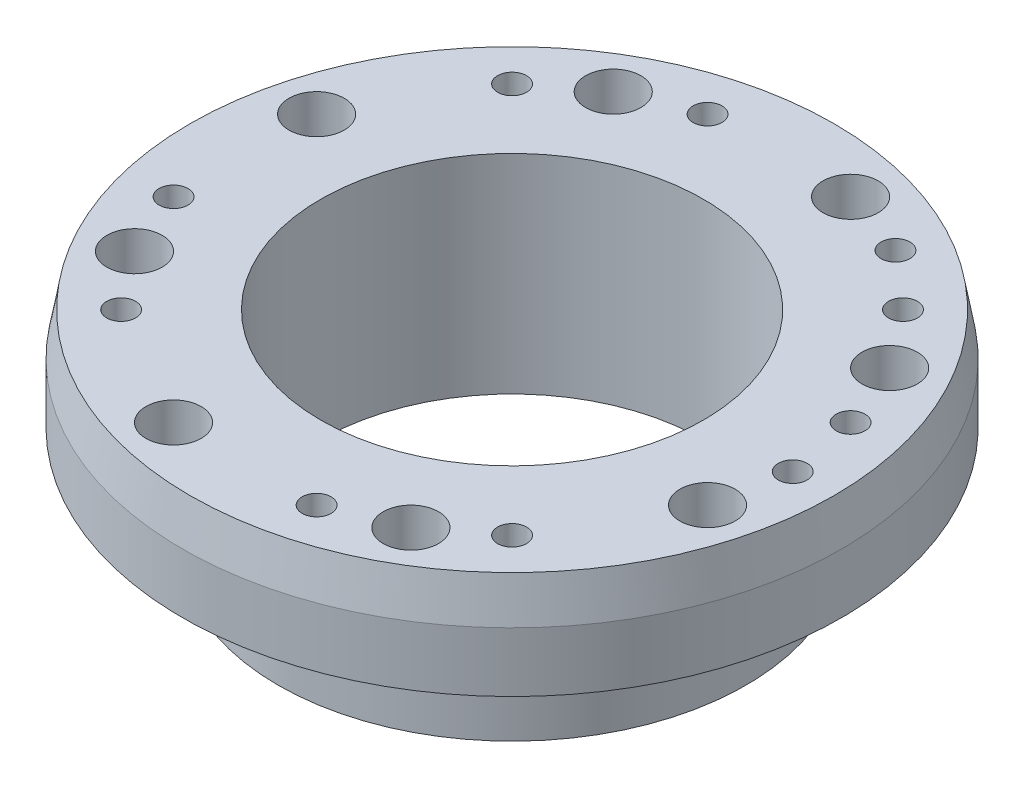
ISO-10303-21;
HEADER;
FILE_DESCRIPTION(('STEP AP214'),'2;1');
FILE_NAME('part.step','',(''),(''),'','','');
FILE_SCHEMA(('AUTOMOTIVE_DESIGN { 1 0 10303 214 1 1 1 1 }'));
ENDSEC;
DATA;
#1=APPLICATION_CONTEXT('core data for automotive mechanical design processes');
#2=APPLICATION_PROTOCOL_DEFINITION('international standard','automotive_design',2000,#1);
#3=PRODUCT_CONTEXT('',#1,'mechanical');
#4=PRODUCT('Part','Part','',(#3));
#5=PRODUCT_RELATED_PRODUCT_CATEGORY('part','',(#4));
#6=PRODUCT_DEFINITION_FORMATION('','',#4);
#7=PRODUCT_DEFINITION_CONTEXT('part definition',#1,'design');
#8=PRODUCT_DEFINITION('design','',#6,#7);
#9=PRODUCT_DEFINITION_SHAPE('','',#8);
#10=(LENGTH_UNIT() NAMED_UNIT(*) SI_UNIT(.MILLI.,.METRE.));
#11=(NAMED_UNIT(*) PLANE_ANGLE_UNIT() SI_UNIT($,.RADIAN.));
#12=(NAMED_UNIT(*) SI_UNIT($,.STERADIAN.) SOLID_ANGLE_UNIT());
#13=UNCERTAINTY_MEASURE_WITH_UNIT(LENGTH_MEASURE(1.E-05),#10,'distance_accuracy_value','');
#14=(GEOMETRIC_REPRESENTATION_CONTEXT(3) GLOBAL_UNCERTAINTY_ASSIGNED_CONTEXT((#13)) GLOBAL_UNIT_ASSIGNED_CONTEXT((#10,
#11,#12)) REPRESENTATION_CONTEXT('',''));
#15=CARTESIAN_POINT('',(0.,0.,0.));
#16=DIRECTION('',(0.,0.,1.));
#17=DIRECTION('',(1.,0.,0.));
#18=AXIS2_PLACEMENT_3D('',#15,#16,#17);
#19=CARTESIAN_POINT('',(0.,-25.,0.));
#20=DIRECTION('',(0.,1.,0.));
#21=DIRECTION('',(0.,0.,1.));
#22=AXIS2_PLACEMENT_3D('',#19,#20,#21);
#23=CYLINDRICAL_SURFACE('',#22,55.);
#24=CARTESIAN_POINT('',(0.,-25.,0.));
#25=DIRECTION('',(0.,1.,0.));
#26=DIRECTION('',(0.,0.,1.));
#27=AXIS2_PLACEMENT_3D('',#24,#25,#26);
#28=CIRCLE('',#27,55.);
#29=CARTESIAN_POINT('',(0.,-25.,55.));
#30=VERTEX_POINT('',#29);
#31=EDGE_CURVE('E19',#30,#30,#28,.F.);
#32=ORIENTED_EDGE('',*,*,#31,.F.);
#33=EDGE_LOOP('',(#32));
#34=FACE_BOUND('',#33,.T.);
#35=CARTESIAN_POINT('',(0.,0.,0.));
#36=DIRECTION('',(0.,1.,0.));
#37=DIRECTION('',(0.,0.,1.));
#38=AXIS2_PLACEMENT_3D('',#35,#36,#37);
#39=CIRCLE('',#38,55.);
#40=CARTESIAN_POINT('',(0.,0.,55.));
#41=VERTEX_POINT('',#40);
#42=EDGE_CURVE('E185',#41,#41,#39,.F.);
#43=ORIENTED_EDGE('',*,*,#42,.T.);
#44=EDGE_LOOP('',(#43));
#45=FACE_BOUND('',#44,.T.);
#46=ADVANCED_FACE('F16',(#34,#45),#23,.T.);
#47=CARTESIAN_POINT('',(-32.5,24.,-56.2916512459887));
#48=DIRECTION('',(0.,1.,0.));
#49=DIRECTION('',(0.,0.,1.));
#50=AXIS2_PLACEMENT_3D('',#47,#48,#49);
#51=CYLINDRICAL_SURFACE('',#50,3.5);
#52=CARTESIAN_POINT('',(-32.5,0.,-56.2916512459887));
#53=DIRECTION('',(0.,1.,0.));
#54=DIRECTION('',(0.,0.,1.));
#55=AXIS2_PLACEMENT_3D('',#52,#53,#54);
#56=CIRCLE('',#55,3.5);
#57=CARTESIAN_POINT('',(-32.5,0.,-52.7916512459887));
#58=VERTEX_POINT('',#57);
#59=EDGE_CURVE('E188',#58,#58,#56,.F.);
#60=ORIENTED_EDGE('',*,*,#59,.T.);
#61=EDGE_LOOP('',(#60));
#62=FACE_BOUND('',#61,.T.);
#63=CARTESIAN_POINT('',(-32.5,14.,-56.2916512459887));
#64=DIRECTION('',(0.,1.,0.));
#65=DIRECTION('',(0.,0.,1.));
#66=AXIS2_PLACEMENT_3D('',#63,#64,#65);
#67=CIRCLE('',#66,3.5);
#68=CARTESIAN_POINT('',(-32.5,14.,-52.7916512459887));
#69=VERTEX_POINT('',#68);
#70=EDGE_CURVE('E182',#69,#69,#67,.T.);
#71=ORIENTED_EDGE('',*,*,#70,.T.);
#72=EDGE_LOOP('',(#71));
#73=FACE_BOUND('',#72,.T.);
#74=ADVANCED_FACE('F219',(#62,#73),#51,.F.);
#75=CARTESIAN_POINT('',(-62.7851787087894,24.,-16.8232379316641));
#76=DIRECTION('',(0.,1.,0.));
#77=DIRECTION('',(0.,0.,1.));
#78=AXIS2_PLACEMENT_3D('',#75,#76,#77);
#79=CYLINDRICAL_SURFACE('',#78,3.5);
#80=CARTESIAN_POINT('',(-62.7851787087894,0.,-16.8232379316641));
#81=DIRECTION('',(0.,1.,0.));
#82=DIRECTION('',(0.,0.,1.));
#83=AXIS2_PLACEMENT_3D('',#80,#81,#82);
#84=CIRCLE('',#83,3.5);
#85=CARTESIAN_POINT('',(-62.7851787087894,0.,-13.3232379316641));
#86=VERTEX_POINT('',#85);
#87=EDGE_CURVE('E191',#86,#86,#84,.F.);
#88=ORIENTED_EDGE('',*,*,#87,.T.);
#89=EDGE_LOOP('',(#88));
#90=FACE_BOUND('',#89,.T.);
#91=CARTESIAN_POINT('',(-62.7851787087894,14.,-16.8232379316641));
#92=DIRECTION('',(0.,1.,0.));
#93=DIRECTION('',(0.,0.,1.));
#94=AXIS2_PLACEMENT_3D('',#91,#92,#93);
#95=CIRCLE('',#94,3.5);
#96=CARTESIAN_POINT('',(-62.7851787087894,14.,-13.3232379316641));
#97=VERTEX_POINT('',#96);
#98=EDGE_CURVE('E179',#97,#97,#95,.T.);
#99=ORIENTED_EDGE('',*,*,#98,.T.);
#100=EDGE_LOOP('',(#99));
#101=FACE_BOUND('',#100,.T.);
#102=ADVANCED_FACE('F407',(#90,#101),#79,.F.);
#103=CARTESIAN_POINT('',(-56.2916512459886,24.,32.5));
#104=DIRECTION('',(0.,1.,0.));
#105=DIRECTION('',(0.,0.,1.));
#106=AXIS2_PLACEMENT_3D('',#103,#104,#105);
#107=CYLINDRICAL_SURFACE('',#106,3.5);
#108=CARTESIAN_POINT('',(-56.2916512459886,0.,32.5));
#109=DIRECTION('',(0.,1.,0.));
#110=DIRECTION('',(0.,0.,1.));
#111=AXIS2_PLACEMENT_3D('',#108,#109,#110);
#112=CIRCLE('',#111,3.5);
#113=CARTESIAN_POINT('',(-56.2916512459886,0.,36.));
#114=VERTEX_POINT('',#113);
#115=EDGE_CURVE('E194',#114,#114,#112,.F.);
#116=ORIENTED_EDGE('',*,*,#115,.T.);
#117=EDGE_LOOP('',(#116));
#118=FACE_BOUND('',#117,.T.);
#119=CARTESIAN_POINT('',(-56.2916512459886,14.,32.5));
#120=DIRECTION('',(0.,1.,0.));
#121=DIRECTION('',(0.,0.,1.));
#122=AXIS2_PLACEMENT_3D('',#119,#120,#121);
#123=CIRCLE('',#122,3.5);
#124=CARTESIAN_POINT('',(-56.2916512459886,14.,36.));
#125=VERTEX_POINT('',#124);
#126=EDGE_CURVE('E176',#125,#125,#123,.T.);
#127=ORIENTED_EDGE('',*,*,#126,.T.);
#128=EDGE_LOOP('',(#127));
#129=FACE_BOUND('',#128,.T.);
#130=ADVANCED_FACE('F403',(#118,#129),#107,.F.);
#131=CARTESIAN_POINT('',(-16.8232379316634,24.,62.7851787087896));
#132=DIRECTION('',(0.,1.,0.));
#133=DIRECTION('',(0.,0.,1.));
#134=AXIS2_PLACEMENT_3D('',#131,#132,#133);
#135=CYLINDRICAL_SURFACE('',#134,3.5);
#136=CARTESIAN_POINT('',(-16.8232379316634,0.,62.7851787087896));
#137=DIRECTION('',(0.,1.,0.));
#138=DIRECTION('',(0.,0.,1.));
#139=AXIS2_PLACEMENT_3D('',#136,#137,#138);
#140=CIRCLE('',#139,3.5);
#141=CARTESIAN_POINT('',(-16.8232379316634,0.,66.2851787087896));
#142=VERTEX_POINT('',#141);
#143=EDGE_CURVE('E197',#142,#142,#140,.F.);
#144=ORIENTED_EDGE('',*,*,#143,.T.);
#145=EDGE_LOOP('',(#144));
#146=FACE_BOUND('',#145,.T.);
#147=CARTESIAN_POINT('',(-16.8232379316634,14.,62.7851787087896));
#148=DIRECTION('',(0.,1.,0.));
#149=DIRECTION('',(0.,0.,1.));
#150=AXIS2_PLACEMENT_3D('',#147,#148,#149);
#151=CIRCLE('',#150,3.5);
#152=CARTESIAN_POINT('',(-16.8232379316634,14.,66.2851787087896));
#153=VERTEX_POINT('',#152);
#154=EDGE_CURVE('E173',#153,#153,#151,.T.);
#155=ORIENTED_EDGE('',*,*,#154,.T.);
#156=EDGE_LOOP('',(#155));
#157=FACE_BOUND('',#156,.T.);
#158=ADVANCED_FACE('F399',(#146,#157),#135,.F.);
#159=CARTESIAN_POINT('',(32.5,24.,56.2916512459885));
#160=DIRECTION('',(0.,1.,0.));
#161=DIRECTION('',(0.,0.,1.));
#162=AXIS2_PLACEMENT_3D('',#159,#160,#161);
#163=CYLINDRICAL_SURFACE('',#162,3.5);
#164=CARTESIAN_POINT('',(32.5,0.,56.2916512459885));
#165=DIRECTION('',(0.,1.,0.));
#166=DIRECTION('',(0.,0.,1.));
#167=AXIS2_PLACEMENT_3D('',#164,#165,#166);
#168=CIRCLE('',#167,3.5);
#169=CARTESIAN_POINT('',(32.5,0.,59.7916512459885));
#170=VERTEX_POINT('',#169);
#171=EDGE_CURVE('E200',#170,#170,#168,.F.);
#172=ORIENTED_EDGE('',*,*,#171,.T.);
#173=EDGE_LOOP('',(#172));
#174=FACE_BOUND('',#173,.T.);
#175=CARTESIAN_POINT('',(32.5,14.,56.2916512459885));
#176=DIRECTION('',(0.,1.,0.));
#177=DIRECTION('',(0.,0.,1.));
#178=AXIS2_PLACEMENT_3D('',#175,#176,#177);
#179=CIRCLE('',#178,3.5);
#180=CARTESIAN_POINT('',(32.5,14.,59.7916512459885));
#181=VERTEX_POINT('',#180);
#182=EDGE_CURVE('E170',#181,#181,#179,.T.);
#183=ORIENTED_EDGE('',*,*,#182,.T.);
#184=EDGE_LOOP('',(#183));
#185=FACE_BOUND('',#184,.T.);
#186=ADVANCED_FACE('F395',(#174,#185),#163,.F.);
#187=CARTESIAN_POINT('',(62.7851787087895,24.,16.8232379316636));
#188=DIRECTION('',(0.,1.,0.));
#189=DIRECTION('',(0.,0.,1.));
#190=AXIS2_PLACEMENT_3D('',#187,#188,#189);
#191=CYLINDRICAL_SURFACE('',#190,3.5);
#192=CARTESIAN_POINT('',(62.7851787087895,0.,16.8232379316636));
#193=DIRECTION('',(0.,1.,0.));
#194=DIRECTION('',(0.,0.,1.));
#195=AXIS2_PLACEMENT_3D('',#192,#193,#194);
#196=CIRCLE('',#195,3.5);
#197=CARTESIAN_POINT('',(62.7851787087895,0.,20.3232379316636));
#198=VERTEX_POINT('',#197);
#199=EDGE_CURVE('E203',#198,#198,#196,.F.);
#200=ORIENTED_EDGE('',*,*,#199,.T.);
#201=EDGE_LOOP('',(#200));
#202=FACE_BOUND('',#201,.T.);
#203=CARTESIAN_POINT('',(62.7851787087895,14.,16.8232379316636));
#204=DIRECTION('',(0.,1.,0.));
#205=DIRECTION('',(0.,0.,1.));
#206=AXIS2_PLACEMENT_3D('',#203,#204,#205);
#207=CIRCLE('',#206,3.5);
#208=CARTESIAN_POINT('',(62.7851787087895,14.,20.3232379316636));
#209=VERTEX_POINT('',#208);
#210=EDGE_CURVE('E167',#209,#209,#207,.T.);
#211=ORIENTED_EDGE('',*,*,#210,.T.);
#212=EDGE_LOOP('',(#211));
#213=FACE_BOUND('',#212,.T.);
#214=ADVANCED_FACE('F391',(#202,#213),#191,.F.);
#215=CARTESIAN_POINT('',(56.2916512459884,24.,-32.5));
#216=DIRECTION('',(0.,1.,0.));
#217=DIRECTION('',(0.,0.,1.));
#218=AXIS2_PLACEMENT_3D('',#215,#216,#217);
#219=CYLINDRICAL_SURFACE('',#218,3.5);
#220=CARTESIAN_POINT('',(56.2916512459884,0.,-32.5));
#221=DIRECTION('',(0.,1.,0.));
#222=DIRECTION('',(0.,0.,1.));
#223=AXIS2_PLACEMENT_3D('',#220,#221,#222);
#224=CIRCLE('',#223,3.5);
#225=CARTESIAN_POINT('',(56.2916512459884,0.,-29.));
#226=VERTEX_POINT('',#225);
#227=EDGE_CURVE('E206',#226,#226,#224,.F.);
#228=ORIENTED_EDGE('',*,*,#227,.T.);
#229=EDGE_LOOP('',(#228));
#230=FACE_BOUND('',#229,.T.);
#231=CARTESIAN_POINT('',(56.2916512459884,14.,-32.5));
#232=DIRECTION('',(0.,1.,0.));
#233=DIRECTION('',(0.,0.,1.));
#234=AXIS2_PLACEMENT_3D('',#231,#232,#233);
#235=CIRCLE('',#234,3.5);
#236=CARTESIAN_POINT('',(56.2916512459884,14.,-29.));
#237=VERTEX_POINT('',#236);
#238=EDGE_CURVE('E164',#237,#237,#235,.T.);
#239=ORIENTED_EDGE('',*,*,#238,.T.);
#240=EDGE_LOOP('',(#239));
#241=FACE_BOUND('',#240,.T.);
#242=ADVANCED_FACE('F385',(#230,#241),#219,.F.);
#243=CARTESIAN_POINT('',(16.8232379316634,24.,-62.7851787087896));
#244=DIRECTION('',(0.,1.,0.));
#245=DIRECTION('',(0.,0.,1.));
#246=AXIS2_PLACEMENT_3D('',#243,#244,#245);
#247=CYLINDRICAL_SURFACE('',#246,3.5);
#248=CARTESIAN_POINT('',(16.8232379316634,0.,-62.7851787087896));
#249=DIRECTION('',(0.,1.,0.));
#250=DIRECTION('',(0.,0.,1.));
#251=AXIS2_PLACEMENT_3D('',#248,#249,#250);
#252=CIRCLE('',#251,3.5);
#253=CARTESIAN_POINT('',(16.8232379316634,0.,-59.2851787087896));
#254=VERTEX_POINT('',#253);
#255=EDGE_CURVE('E208',#254,#254,#252,.F.);
#256=ORIENTED_EDGE('',*,*,#255,.T.);
#257=EDGE_LOOP('',(#256));
#258=FACE_BOUND('',#257,.T.);
#259=CARTESIAN_POINT('',(16.8232379316634,14.,-62.7851787087896));
#260=DIRECTION('',(0.,1.,0.));
#261=DIRECTION('',(0.,0.,1.));
#262=AXIS2_PLACEMENT_3D('',#259,#260,#261);
#263=CIRCLE('',#262,3.5);
#264=CARTESIAN_POINT('',(16.8232379316634,14.,-59.2851787087896));
#265=VERTEX_POINT('',#264);
#266=EDGE_CURVE('E161',#265,#265,#263,.T.);
#267=ORIENTED_EDGE('',*,*,#266,.T.);
#268=EDGE_LOOP('',(#267));
#269=FACE_BOUND('',#268,.T.);
#270=ADVANCED_FACE('F379',(#258,#269),#247,.F.);
#271=CARTESIAN_POINT('',(0.,-25.,0.));
#272=DIRECTION('',(0.,-1.,0.));
#273=DIRECTION('',(0.,0.,-1.));
#274=AXIS2_PLACEMENT_3D('',#271,#272,#273);
#275=PLANE('',#274);
#276=ORIENTED_EDGE('',*,*,#31,.T.);
#277=EDGE_LOOP('',(#276));
#278=FACE_BOUND('',#277,.T.);
#279=CARTESIAN_POINT('',(0.,-25.,0.));
#280=DIRECTION('',(0.,1.,0.));
#281=DIRECTION('',(0.,0.,1.));
#282=AXIS2_PLACEMENT_3D('',#279,#280,#281);
#283=CIRCLE('',#282,45.);
#284=CARTESIAN_POINT('',(0.,-25.,45.));
#285=VERTEX_POINT('',#284);
#286=EDGE_CURVE('E55',#285,#285,#283,.T.);
#287=ORIENTED_EDGE('',*,*,#286,.T.);
#288=EDGE_LOOP('',(#287));
#289=FACE_BOUND('',#288,.T.);
#290=ADVANCED_FACE('F42',(#278,#289),#275,.T.);
#291=CARTESIAN_POINT('',(-45.9619407771263,4.25000000001319,45.9619407771249));
#292=DIRECTION('',(0.,1.,0.));
#293=DIRECTION('',(0.,0.,1.));
#294=AXIS2_PLACEMENT_3D('',#291,#292,#293);
#295=CONICAL_SURFACE('',#294,3.39999999996446,1.02974425866465);
#296=CARTESIAN_POINT('',(-45.9619407771263,2.20707389530616,45.9619407771249));
#297=VERTEX_POINT('',#296);
#298=VERTEX_LOOP('',#297);
#299=FACE_BOUND('',#298,.T.);
#300=CARTESIAN_POINT('',(-45.9619407771263,4.25,45.9619407771249));
#301=DIRECTION('',(0.,1.,0.));
#302=DIRECTION('',(0.,0.,1.));
#303=AXIS2_PLACEMENT_3D('',#300,#301,#302);
#304=CIRCLE('',#303,3.4);
#305=CARTESIAN_POINT('',(-45.9619407771263,4.25,49.3619407771249));
#306=VERTEX_POINT('',#305);
#307=EDGE_CURVE('E46',#306,#306,#304,.T.);
#308=ORIENTED_EDGE('',*,*,#307,.T.);
#309=EDGE_LOOP('',(#308));
#310=FACE_BOUND('',#309,.T.);
#311=ADVANCED_FACE('F38',(#299,#310),#295,.F.);
#312=CARTESIAN_POINT('',(45.9619407771254,4.25000000001319,45.9619407771258));
#313=DIRECTION('',(0.,1.,0.));
#314=DIRECTION('',(0.,0.,1.));
#315=AXIS2_PLACEMENT_3D('',#312,#313,#314);
#316=CONICAL_SURFACE('',#315,3.3999999999635,1.0297442586644);
#317=CARTESIAN_POINT('',(45.9619407771254,2.20707389530616,45.9619407771258));
#318=VERTEX_POINT('',#317);
#319=VERTEX_LOOP('',#318);
#320=FACE_BOUND('',#319,.T.);
#321=CARTESIAN_POINT('',(45.9619407771254,4.25,45.9619407771258));
#322=DIRECTION('',(0.,1.,0.));
#323=DIRECTION('',(0.,0.,1.));
#324=AXIS2_PLACEMENT_3D('',#321,#322,#323);
#325=CIRCLE('',#324,3.4);
#326=CARTESIAN_POINT('',(45.9619407771254,4.25,49.3619407771258));
#327=VERTEX_POINT('',#326);
#328=EDGE_CURVE('E48',#327,#327,#325,.T.);
#329=ORIENTED_EDGE('',*,*,#328,.T.);
#330=EDGE_LOOP('',(#329));
#331=FACE_BOUND('',#330,.T.);
#332=ADVANCED_FACE('F41',(#320,#331),#316,.F.);
#333=CARTESIAN_POINT('',(45.961940777126,4.25000000001319,-45.9619407771252));
#334=DIRECTION('',(0.,1.,0.));
#335=DIRECTION('',(0.,0.,1.));
#336=AXIS2_PLACEMENT_3D('',#333,#334,#335);
#337=CONICAL_SURFACE('',#336,3.39999999997738,1.02974425866801);
#338=CARTESIAN_POINT('',(45.961940777126,2.20707389530616,-45.9619407771252));
#339=VERTEX_POINT('',#338);
#340=VERTEX_LOOP('',#339);
#341=FACE_BOUND('',#340,.T.);
#342=CARTESIAN_POINT('',(45.961940777126,4.25,-45.9619407771252));
#343=DIRECTION('',(0.,1.,0.));
#344=DIRECTION('',(0.,0.,1.));
#345=AXIS2_PLACEMENT_3D('',#342,#343,#344);
#346=CIRCLE('',#345,3.4);
#347=CARTESIAN_POINT('',(45.961940777126,4.25,-42.5619407771252));
#348=VERTEX_POINT('',#347);
#349=EDGE_CURVE('E52',#348,#348,#346,.T.);
#350=ORIENTED_EDGE('',*,*,#349,.T.);
#351=EDGE_LOOP('',(#350));
#352=FACE_BOUND('',#351,.T.);
#353=ADVANCED_FACE('F272',(#341,#352),#337,.F.);
#354=CARTESIAN_POINT('',(-45.9619407771254,4.25000000001319,-45.9619407771258));
#355=DIRECTION('',(0.,1.,0.));
#356=DIRECTION('',(0.,0.,1.));
#357=AXIS2_PLACEMENT_3D('',#354,#355,#356);
#358=CONICAL_SURFACE('',#357,3.39999999997802,1.02974425866817);
#359=CARTESIAN_POINT('',(-45.9619407771254,2.20707389530616,-45.9619407771258));
#360=VERTEX_POINT('',#359);
#361=VERTEX_LOOP('',#360);
#362=FACE_BOUND('',#361,.T.);
#363=CARTESIAN_POINT('',(-45.9619407771254,4.25,-45.9619407771258));
#364=DIRECTION('',(0.,1.,0.));
#365=DIRECTION('',(0.,0.,1.));
#366=AXIS2_PLACEMENT_3D('',#363,#364,#365);
#367=CIRCLE('',#366,3.4);
#368=CARTESIAN_POINT('',(-45.9619407771254,4.25,-42.5619407771258));
#369=VERTEX_POINT('',#368);
#370=EDGE_CURVE('E154',#369,#369,#367,.T.);
#371=ORIENTED_EDGE('',*,*,#370,.T.);
#372=EDGE_LOOP('',(#371));
#373=FACE_BOUND('',#372,.T.);
#374=ADVANCED_FACE('F226',(#362,#373),#358,.F.);
#375=CARTESIAN_POINT('',(0.,0.,0.));
#376=DIRECTION('',(0.,1.,0.));
#377=DIRECTION('',(0.,0.,1.));
#378=AXIS2_PLACEMENT_3D('',#375,#376,#377);
#379=PLANE('',#378);
#380=ORIENTED_EDGE('',*,*,#42,.F.);
#381=EDGE_LOOP('',(#380));
#382=FACE_BOUND('',#381,.T.);
#383=CARTESIAN_POINT('',(66.,0.,-2.4980018054066E-13));
#384=DIRECTION('',(0.,1.,0.));
#385=DIRECTION('',(0.,0.,1.));
#386=AXIS2_PLACEMENT_3D('',#383,#384,#385);
#387=CIRCLE('',#386,3.4);
#388=CARTESIAN_POINT('',(66.,0.,3.39999999999975));
#389=VERTEX_POINT('',#388);
#390=EDGE_CURVE('E49',#389,#389,#387,.T.);
#391=ORIENTED_EDGE('',*,*,#390,.T.);
#392=EDGE_LOOP('',(#391));
#393=FACE_BOUND('',#392,.T.);
#394=CARTESIAN_POINT('',(-62.7851787087896,0.,16.8232379316632));
#395=DIRECTION('',(0.,1.,0.));
#396=DIRECTION('',(0.,0.,1.));
#397=AXIS2_PLACEMENT_3D('',#394,#395,#396);
#398=CIRCLE('',#397,3.4);
#399=CARTESIAN_POINT('',(-62.7851787087896,0.,20.2232379316632));
#400=VERTEX_POINT('',#399);
#401=EDGE_CURVE('E152',#400,#400,#398,.T.);
#402=ORIENTED_EDGE('',*,*,#401,.T.);
#403=EDGE_LOOP('',(#402));
#404=FACE_BOUND('',#403,.T.);
#405=CARTESIAN_POINT('',(16.8232379316639,0.,62.7851787087894));
#406=DIRECTION('',(0.,1.,0.));
#407=DIRECTION('',(0.,0.,1.));
#408=AXIS2_PLACEMENT_3D('',#405,#406,#407);
#409=CIRCLE('',#408,3.4);
#410=CARTESIAN_POINT('',(16.8232379316639,0.,66.1851787087894));
#411=VERTEX_POINT('',#410);
#412=EDGE_CURVE('E149',#411,#411,#409,.T.);
#413=ORIENTED_EDGE('',*,*,#412,.T.);
#414=EDGE_LOOP('',(#413));
#415=FACE_BOUND('',#414,.T.);
#416=CARTESIAN_POINT('',(62.7851787087895,0.,-16.8232379316637));
#417=DIRECTION('',(0.,1.,0.));
#418=DIRECTION('',(0.,0.,1.));
#419=AXIS2_PLACEMENT_3D('',#416,#417,#418);
#420=CIRCLE('',#419,3.4);
#421=CARTESIAN_POINT('',(62.7851787087895,0.,-13.4232379316637));
#422=VERTEX_POINT('',#421);
#423=EDGE_CURVE('E146',#422,#422,#420,.T.);
#424=ORIENTED_EDGE('',*,*,#423,.T.);
#425=EDGE_LOOP('',(#424));
#426=FACE_BOUND('',#425,.T.);
#427=CARTESIAN_POINT('',(-16.8232379316639,0.,-62.7851787087894));
#428=DIRECTION('',(0.,1.,0.));
#429=DIRECTION('',(0.,0.,1.));
#430=AXIS2_PLACEMENT_3D('',#427,#428,#429);
#431=CIRCLE('',#430,3.4);
#432=CARTESIAN_POINT('',(-16.8232379316639,0.,-59.3851787087894));
#433=VERTEX_POINT('',#432);
#434=EDGE_CURVE('E143',#433,#433,#431,.T.);
#435=ORIENTED_EDGE('',*,*,#434,.T.);
#436=EDGE_LOOP('',(#435));
#437=FACE_BOUND('',#436,.T.);
#438=CARTESIAN_POINT('',(32.9999999999996,0.,-57.1576766497732));
#439=DIRECTION('',(0.,1.,0.));
#440=DIRECTION('',(0.,0.,1.));
#441=AXIS2_PLACEMENT_3D('',#438,#439,#440);
#442=CIRCLE('',#441,3.4);
#443=CARTESIAN_POINT('',(32.9999999999996,0.,-53.7576766497732));
#444=VERTEX_POINT('',#443);
#445=EDGE_CURVE('E140',#444,#444,#442,.T.);
#446=ORIENTED_EDGE('',*,*,#445,.T.);
#447=EDGE_LOOP('',(#446));
#448=FACE_BOUND('',#447,.T.);
#449=ORIENTED_EDGE('',*,*,#59,.F.);
#450=EDGE_LOOP('',(#449));
#451=FACE_BOUND('',#450,.T.);
#452=ORIENTED_EDGE('',*,*,#87,.F.);
#453=EDGE_LOOP('',(#452));
#454=FACE_BOUND('',#453,.T.);
#455=ORIENTED_EDGE('',*,*,#115,.F.);
#456=EDGE_LOOP('',(#455));
#457=FACE_BOUND('',#456,.T.);
#458=ORIENTED_EDGE('',*,*,#143,.F.);
#459=EDGE_LOOP('',(#458));
#460=FACE_BOUND('',#459,.T.);
#461=ORIENTED_EDGE('',*,*,#171,.F.);
#462=EDGE_LOOP('',(#461));
#463=FACE_BOUND('',#462,.T.);
#464=ORIENTED_EDGE('',*,*,#199,.F.);
#465=EDGE_LOOP('',(#464));
#466=FACE_BOUND('',#465,.T.);
#467=ORIENTED_EDGE('',*,*,#227,.F.);
#468=EDGE_LOOP('',(#467));
#469=FACE_BOUND('',#468,.T.);
#470=ORIENTED_EDGE('',*,*,#255,.F.);
#471=EDGE_LOOP('',(#470));
#472=FACE_BOUND('',#471,.T.);
#473=CARTESIAN_POINT('',(0.,0.,0.));
#474=DIRECTION('',(0.,-1.,0.));
#475=DIRECTION('',(0.,0.,-1.));
#476=AXIS2_PLACEMENT_3D('',#473,#474,#475);
#477=CIRCLE('',#476,77.5);
#478=CARTESIAN_POINT('',(0.,0.,-77.5));
#479=VERTEX_POINT('',#478);
#480=EDGE_CURVE('E158',#479,#479,#477,.F.);
#481=ORIENTED_EDGE('',*,*,#480,.F.);
#482=EDGE_LOOP('',(#481));
#483=FACE_BOUND('',#482,.T.);
#484=ADVANCED_FACE('F222',(#382,#393,#404,#415,#426,#437,#448,#451,#454,#457,#460,#463,#466,
#469,#472,#483),#379,.F.);
#485=CARTESIAN_POINT('',(-29.,14.,-56.2916512459887));
#486=DIRECTION('',(0.,-1.,0.));
#487=DIRECTION('',(0.,0.,-1.));
#488=AXIS2_PLACEMENT_3D('',#485,#486,#487);
#489=PLANE('',#488);
#490=CARTESIAN_POINT('',(-32.5,14.,-56.2916512459887));
#491=DIRECTION('',(0.,1.,0.));
#492=DIRECTION('',(0.,0.,1.));
#493=AXIS2_PLACEMENT_3D('',#490,#491,#492);
#494=CIRCLE('',#493,6.5);
#495=CARTESIAN_POINT('',(-32.5,14.,-49.7916512459887));
#496=VERTEX_POINT('',#495);
#497=EDGE_CURVE('E137',#496,#496,#494,.T.);
#498=ORIENTED_EDGE('',*,*,#497,.T.);
#499=EDGE_LOOP('',(#498));
#500=FACE_BOUND('',#499,.T.);
#501=ORIENTED_EDGE('',*,*,#70,.F.);
#502=EDGE_LOOP('',(#501));
#503=FACE_BOUND('',#502,.T.);
#504=ADVANCED_FACE('F225',(#500,#503),#489,.F.);
#505=CARTESIAN_POINT('',(-59.2851787087894,14.,-16.8232379316641));
#506=DIRECTION('',(0.,-1.,0.));
#507=DIRECTION('',(0.,0.,-1.));
#508=AXIS2_PLACEMENT_3D('',#505,#506,#507);
#509=PLANE('',#508);
#510=CARTESIAN_POINT('',(-62.7851787087894,14.,-16.8232379316641));
#511=DIRECTION('',(0.,1.,0.));
#512=DIRECTION('',(0.,0.,1.));
#513=AXIS2_PLACEMENT_3D('',#510,#511,#512);
#514=CIRCLE('',#513,6.5);
#515=CARTESIAN_POINT('',(-62.7851787087894,14.,-10.3232379316641));
#516=VERTEX_POINT('',#515);
#517=EDGE_CURVE('E134',#516,#516,#514,.T.);
#518=ORIENTED_EDGE('',*,*,#517,.T.);
#519=EDGE_LOOP('',(#518));
#520=FACE_BOUND('',#519,.T.);
#521=ORIENTED_EDGE('',*,*,#98,.F.);
#522=EDGE_LOOP('',(#521));
#523=FACE_BOUND('',#522,.T.);
#524=ADVANCED_FACE('F420',(#520,#523),#509,.F.);
#525=CARTESIAN_POINT('',(-52.7916512459886,14.,32.5));
#526=DIRECTION('',(0.,-1.,0.));
#527=DIRECTION('',(0.,0.,-1.));
#528=AXIS2_PLACEMENT_3D('',#525,#526,#527);
#529=PLANE('',#528);
#530=CARTESIAN_POINT('',(-56.2916512459886,14.,32.5));
#531=DIRECTION('',(0.,1.,0.));
#532=DIRECTION('',(0.,0.,1.));
#533=AXIS2_PLACEMENT_3D('',#530,#531,#532);
#534=CIRCLE('',#533,6.5);
#535=CARTESIAN_POINT('',(-56.2916512459886,14.,39.));
#536=VERTEX_POINT('',#535);
#537=EDGE_CURVE('E131',#536,#536,#534,.T.);
#538=ORIENTED_EDGE('',*,*,#537,.T.);
#539=EDGE_LOOP('',(#538));
#540=FACE_BOUND('',#539,.T.);
#541=ORIENTED_EDGE('',*,*,#126,.F.);
#542=EDGE_LOOP('',(#541));
#543=FACE_BOUND('',#542,.T.);
#544=ADVANCED_FACE('F427',(#540,#543),#529,.F.);
#545=CARTESIAN_POINT('',(-13.3232379316634,14.,62.7851787087896));
#546=DIRECTION('',(0.,-1.,0.));
#547=DIRECTION('',(0.,0.,-1.));
#548=AXIS2_PLACEMENT_3D('',#545,#546,#547);
#549=PLANE('',#548);
#550=CARTESIAN_POINT('',(-16.8232379316634,14.,62.7851787087896));
#551=DIRECTION('',(0.,1.,0.));
#552=DIRECTION('',(0.,0.,1.));
#553=AXIS2_PLACEMENT_3D('',#550,#551,#552);
#554=CIRCLE('',#553,6.5);
#555=CARTESIAN_POINT('',(-16.8232379316634,14.,69.2851787087896));
#556=VERTEX_POINT('',#555);
#557=EDGE_CURVE('E128',#556,#556,#554,.T.);
#558=ORIENTED_EDGE('',*,*,#557,.T.);
#559=EDGE_LOOP('',(#558));
#560=FACE_BOUND('',#559,.T.);
#561=ORIENTED_EDGE('',*,*,#154,.F.);
#562=EDGE_LOOP('',(#561));
#563=FACE_BOUND('',#562,.T.);
#564=ADVANCED_FACE('F486',(#560,#563),#549,.F.);
#565=CARTESIAN_POINT('',(36.,14.,56.2916512459885));
#566=DIRECTION('',(0.,-1.,0.));
#567=DIRECTION('',(0.,0.,-1.));
#568=AXIS2_PLACEMENT_3D('',#565,#566,#567);
#569=PLANE('',#568);
#570=CARTESIAN_POINT('',(32.5,14.,56.2916512459885));
#571=DIRECTION('',(0.,1.,0.));
#572=DIRECTION('',(0.,0.,1.));
#573=AXIS2_PLACEMENT_3D('',#570,#571,#572);
#574=CIRCLE('',#573,6.5);
#575=CARTESIAN_POINT('',(32.5,14.,62.7916512459885));
#576=VERTEX_POINT('',#575);
#577=EDGE_CURVE('E125',#576,#576,#574,.T.);
#578=ORIENTED_EDGE('',*,*,#577,.T.);
#579=EDGE_LOOP('',(#578));
#580=FACE_BOUND('',#579,.T.);
#581=ORIENTED_EDGE('',*,*,#182,.F.);
#582=EDGE_LOOP('',(#581));
#583=FACE_BOUND('',#582,.T.);
#584=ADVANCED_FACE('F495',(#580,#583),#569,.F.);
#585=CARTESIAN_POINT('',(66.2851787087895,14.,16.8232379316636));
#586=DIRECTION('',(0.,-1.,0.));
#587=DIRECTION('',(0.,0.,-1.));
#588=AXIS2_PLACEMENT_3D('',#585,#586,#587);
#589=PLANE('',#588);
#590=CARTESIAN_POINT('',(62.7851787087895,14.,16.8232379316636));
#591=DIRECTION('',(0.,1.,0.));
#592=DIRECTION('',(0.,0.,1.));
#593=AXIS2_PLACEMENT_3D('',#590,#591,#592);
#594=CIRCLE('',#593,6.5);
#595=CARTESIAN_POINT('',(62.7851787087895,14.,23.3232379316636));
#596=VERTEX_POINT('',#595);
#597=EDGE_CURVE('E122',#596,#596,#594,.T.);
#598=ORIENTED_EDGE('',*,*,#597,.T.);
#599=EDGE_LOOP('',(#598));
#600=FACE_BOUND('',#599,.T.);
#601=ORIENTED_EDGE('',*,*,#210,.F.);
#602=EDGE_LOOP('',(#601));
#603=FACE_BOUND('',#602,.T.);
#604=ADVANCED_FACE('F505',(#600,#603),#589,.F.);
#605=CARTESIAN_POINT('',(59.7916512459884,14.,-32.5));
#606=DIRECTION('',(0.,-1.,0.));
#607=DIRECTION('',(0.,0.,-1.));
#608=AXIS2_PLACEMENT_3D('',#605,#606,#607);
#609=PLANE('',#608);
#610=CARTESIAN_POINT('',(56.2916512459884,14.,-32.5));
#611=DIRECTION('',(0.,1.,0.));
#612=DIRECTION('',(0.,0.,1.));
#613=AXIS2_PLACEMENT_3D('',#610,#611,#612);
#614=CIRCLE('',#613,6.5);
#615=CARTESIAN_POINT('',(56.2916512459884,14.,-26.));
#616=VERTEX_POINT('',#615);
#617=EDGE_CURVE('E119',#616,#616,#614,.T.);
#618=ORIENTED_EDGE('',*,*,#617,.T.);
#619=EDGE_LOOP('',(#618));
#620=FACE_BOUND('',#619,.T.);
#621=ORIENTED_EDGE('',*,*,#238,.F.);
#622=EDGE_LOOP('',(#621));
#623=FACE_BOUND('',#622,.T.);
#624=ADVANCED_FACE('F515',(#620,#623),#609,.F.);
#625=CARTESIAN_POINT('',(20.3232379316635,14.,-62.7851787087896));
#626=DIRECTION('',(0.,-1.,0.));
#627=DIRECTION('',(0.,0.,-1.));
#628=AXIS2_PLACEMENT_3D('',#625,#626,#627);
#629=PLANE('',#628);
#630=CARTESIAN_POINT('',(16.8232379316634,14.,-62.7851787087896));
#631=DIRECTION('',(0.,1.,0.));
#632=DIRECTION('',(0.,0.,1.));
#633=AXIS2_PLACEMENT_3D('',#630,#631,#632);
#634=CIRCLE('',#633,6.5);
#635=CARTESIAN_POINT('',(16.8232379316634,14.,-56.2851787087896));
#636=VERTEX_POINT('',#635);
#637=EDGE_CURVE('E116',#636,#636,#634,.T.);
#638=ORIENTED_EDGE('',*,*,#637,.T.);
#639=EDGE_LOOP('',(#638));
#640=FACE_BOUND('',#639,.T.);
#641=ORIENTED_EDGE('',*,*,#266,.F.);
#642=EDGE_LOOP('',(#641));
#643=FACE_BOUND('',#642,.T.);
#644=ADVANCED_FACE('F261',(#640,#643),#629,.F.);
#645=CARTESIAN_POINT('',(0.,24.,0.));
#646=DIRECTION('',(0.,-1.,0.));
#647=DIRECTION('',(0.,0.,-1.));
#648=AXIS2_PLACEMENT_3D('',#645,#646,#647);
#649=CYLINDRICAL_SURFACE('',#648,77.5);
#650=ORIENTED_EDGE('',*,*,#480,.T.);
#651=EDGE_LOOP('',(#650));
#652=FACE_BOUND('',#651,.T.);
#653=CARTESIAN_POINT('',(0.,13.9999999999997,0.));
#654=DIRECTION('',(0.,-1.,0.));
#655=DIRECTION('',(0.,0.,-1.));
#656=AXIS2_PLACEMENT_3D('',#653,#654,#655);
#657=CIRCLE('',#656,77.5);
#658=CARTESIAN_POINT('',(0.,13.9999999999997,-77.5));
#659=VERTEX_POINT('',#658);
#660=EDGE_CURVE('E115',#659,#659,#657,.F.);
#661=ORIENTED_EDGE('',*,*,#660,.F.);
#662=EDGE_LOOP('',(#661));
#663=FACE_BOUND('',#662,.T.);
#664=ADVANCED_FACE('F257',(#652,#663),#649,.T.);
#665=CARTESIAN_POINT('',(0.,-25.,0.));
#666=DIRECTION('',(0.,1.,0.));
#667=DIRECTION('',(0.,0.,1.));
#668=AXIS2_PLACEMENT_3D('',#665,#666,#667);
#669=CYLINDRICAL_SURFACE('',#668,45.);
#670=CARTESIAN_POINT('',(0.,24.,0.));
#671=DIRECTION('',(0.,1.,0.));
#672=DIRECTION('',(0.,0.,1.));
#673=AXIS2_PLACEMENT_3D('',#670,#671,#672);
#674=CIRCLE('',#673,45.);
#675=CARTESIAN_POINT('',(0.,24.,45.));
#676=VERTEX_POINT('',#675);
#677=EDGE_CURVE('E112',#676,#676,#674,.F.);
#678=ORIENTED_EDGE('',*,*,#677,.F.);
#679=EDGE_LOOP('',(#678));
#680=FACE_BOUND('',#679,.T.);
#681=ORIENTED_EDGE('',*,*,#286,.F.);
#682=EDGE_LOOP('',(#681));
#683=FACE_BOUND('',#682,.T.);
#684=ADVANCED_FACE('F260',(#680,#683),#669,.F.);
#685=CARTESIAN_POINT('',(66.,24.,-2.4980018054066E-13));
#686=DIRECTION('',(0.,1.,0.));
#687=DIRECTION('',(0.,0.,1.));
#688=AXIS2_PLACEMENT_3D('',#685,#686,#687);
#689=CYLINDRICAL_SURFACE('',#688,3.4);
#690=CARTESIAN_POINT('',(66.,24.,-2.4980018054066E-13));
#691=DIRECTION('',(0.,1.,0.));
#692=DIRECTION('',(0.,0.,1.));
#693=AXIS2_PLACEMENT_3D('',#690,#691,#692);
#694=CIRCLE('',#693,3.4);
#695=CARTESIAN_POINT('',(66.,24.,3.39999999999975));
#696=VERTEX_POINT('',#695);
#697=EDGE_CURVE('E109',#696,#696,#694,.F.);
#698=ORIENTED_EDGE('',*,*,#697,.F.);
#699=EDGE_LOOP('',(#698));
#700=FACE_BOUND('',#699,.T.);
#701=ORIENTED_EDGE('',*,*,#390,.F.);
#702=EDGE_LOOP('',(#701));
#703=FACE_BOUND('',#702,.T.);
#704=ADVANCED_FACE('F375',(#700,#703),#689,.F.);
#705=CARTESIAN_POINT('',(-45.9619407771263,24.,45.9619407771249));
#706=DIRECTION('',(0.,1.,0.));
#707=DIRECTION('',(0.,0.,1.));
#708=AXIS2_PLACEMENT_3D('',#705,#706,#707);
#709=CYLINDRICAL_SURFACE('',#708,3.4);
#710=CARTESIAN_POINT('',(-45.9619407771263,24.,45.9619407771249));
#711=DIRECTION('',(0.,1.,0.));
#712=DIRECTION('',(0.,0.,1.));
#713=AXIS2_PLACEMENT_3D('',#710,#711,#712);
#714=CIRCLE('',#713,3.4);
#715=CARTESIAN_POINT('',(-45.9619407771263,24.,49.3619407771249));
#716=VERTEX_POINT('',#715);
#717=EDGE_CURVE('E106',#716,#716,#714,.F.);
#718=ORIENTED_EDGE('',*,*,#717,.F.);
#719=EDGE_LOOP('',(#718));
#720=FACE_BOUND('',#719,.T.);
#721=ORIENTED_EDGE('',*,*,#307,.F.);
#722=EDGE_LOOP('',(#721));
#723=FACE_BOUND('',#722,.T.);
#724=ADVANCED_FACE('F289',(#720,#723),#709,.F.);
#725=CARTESIAN_POINT('',(45.9619407771254,24.,45.9619407771258));
#726=DIRECTION('',(0.,1.,0.));
#727=DIRECTION('',(0.,0.,1.));
#728=AXIS2_PLACEMENT_3D('',#725,#726,#727);
#729=CYLINDRICAL_SURFACE('',#728,3.4);
#730=CARTESIAN_POINT('',(45.9619407771254,24.,45.9619407771258));
#731=DIRECTION('',(0.,1.,0.));
#732=DIRECTION('',(0.,0.,1.));
#733=AXIS2_PLACEMENT_3D('',#730,#731,#732);
#734=CIRCLE('',#733,3.4);
#735=CARTESIAN_POINT('',(45.9619407771254,24.,49.3619407771258));
#736=VERTEX_POINT('',#735);
#737=EDGE_CURVE('E103',#736,#736,#734,.F.);
#738=ORIENTED_EDGE('',*,*,#737,.F.);
#739=EDGE_LOOP('',(#738));
#740=FACE_BOUND('',#739,.T.);
#741=ORIENTED_EDGE('',*,*,#328,.F.);
#742=EDGE_LOOP('',(#741));
#743=FACE_BOUND('',#742,.T.);
#744=ADVANCED_FACE('F277',(#740,#743),#729,.F.);
#745=CARTESIAN_POINT('',(45.961940777126,24.,-45.9619407771252));
#746=DIRECTION('',(0.,1.,0.));
#747=DIRECTION('',(0.,0.,1.));
#748=AXIS2_PLACEMENT_3D('',#745,#746,#747);
#749=CYLINDRICAL_SURFACE('',#748,3.4);
#750=CARTESIAN_POINT('',(45.961940777126,24.,-45.9619407771252));
#751=DIRECTION('',(0.,1.,0.));
#752=DIRECTION('',(0.,0.,1.));
#753=AXIS2_PLACEMENT_3D('',#750,#751,#752);
#754=CIRCLE('',#753,3.4);
#755=CARTESIAN_POINT('',(45.961940777126,24.,-42.5619407771252));
#756=VERTEX_POINT('',#755);
#757=EDGE_CURVE('E100',#756,#756,#754,.F.);
#758=ORIENTED_EDGE('',*,*,#757,.F.);
#759=EDGE_LOOP('',(#758));
#760=FACE_BOUND('',#759,.T.);
#761=ORIENTED_EDGE('',*,*,#349,.F.);
#762=EDGE_LOOP('',(#761));
#763=FACE_BOUND('',#762,.T.);
#764=ADVANCED_FACE('F274',(#760,#763),#749,.F.);
#765=CARTESIAN_POINT('',(-45.9619407771254,24.,-45.9619407771258));
#766=DIRECTION('',(0.,1.,0.));
#767=DIRECTION('',(0.,0.,1.));
#768=AXIS2_PLACEMENT_3D('',#765,#766,#767);
#769=CYLINDRICAL_SURFACE('',#768,3.4);
#770=CARTESIAN_POINT('',(-45.9619407771254,24.,-45.9619407771258));
#771=DIRECTION('',(0.,1.,0.));
#772=DIRECTION('',(0.,0.,1.));
#773=AXIS2_PLACEMENT_3D('',#770,#771,#772);
#774=CIRCLE('',#773,3.4);
#775=CARTESIAN_POINT('',(-45.9619407771254,24.,-42.5619407771258));
#776=VERTEX_POINT('',#775);
#777=EDGE_CURVE('E97',#776,#776,#774,.F.);
#778=ORIENTED_EDGE('',*,*,#777,.F.);
#779=EDGE_LOOP('',(#778));
#780=FACE_BOUND('',#779,.T.);
#781=ORIENTED_EDGE('',*,*,#370,.F.);
#782=EDGE_LOOP('',(#781));
#783=FACE_BOUND('',#782,.T.);
#784=ADVANCED_FACE('F276',(#780,#783),#769,.F.);
#785=CARTESIAN_POINT('',(-62.7851787087896,24.,16.8232379316632));
#786=DIRECTION('',(0.,1.,0.));
#787=DIRECTION('',(0.,0.,1.));
#788=AXIS2_PLACEMENT_3D('',#785,#786,#787);
#789=CYLINDRICAL_SURFACE('',#788,3.4);
#790=CARTESIAN_POINT('',(-62.7851787087896,24.,16.8232379316632));
#791=DIRECTION('',(0.,1.,0.));
#792=DIRECTION('',(0.,0.,1.));
#793=AXIS2_PLACEMENT_3D('',#790,#791,#792);
#794=CIRCLE('',#793,3.4);
#795=CARTESIAN_POINT('',(-62.7851787087896,24.,20.2232379316632));
#796=VERTEX_POINT('',#795);
#797=EDGE_CURVE('E94',#796,#796,#794,.F.);
#798=ORIENTED_EDGE('',*,*,#797,.F.);
#799=EDGE_LOOP('',(#798));
#800=FACE_BOUND('',#799,.T.);
#801=ORIENTED_EDGE('',*,*,#401,.F.);
#802=EDGE_LOOP('',(#801));
#803=FACE_BOUND('',#802,.T.);
#804=ADVANCED_FACE('F286',(#800,#803),#789,.F.);
#805=CARTESIAN_POINT('',(16.8232379316639,24.,62.7851787087894));
#806=DIRECTION('',(0.,1.,0.));
#807=DIRECTION('',(0.,0.,1.));
#808=AXIS2_PLACEMENT_3D('',#805,#806,#807);
#809=CYLINDRICAL_SURFACE('',#808,3.4);
#810=CARTESIAN_POINT('',(16.8232379316639,24.,62.7851787087894));
#811=DIRECTION('',(0.,1.,0.));
#812=DIRECTION('',(0.,0.,1.));
#813=AXIS2_PLACEMENT_3D('',#810,#811,#812);
#814=CIRCLE('',#813,3.4);
#815=CARTESIAN_POINT('',(16.8232379316639,24.,66.1851787087894));
#816=VERTEX_POINT('',#815);
#817=EDGE_CURVE('E91',#816,#816,#814,.F.);
#818=ORIENTED_EDGE('',*,*,#817,.F.);
#819=EDGE_LOOP('',(#818));
#820=FACE_BOUND('',#819,.T.);
#821=ORIENTED_EDGE('',*,*,#412,.F.);
#822=EDGE_LOOP('',(#821));
#823=FACE_BOUND('',#822,.T.);
#824=ADVANCED_FACE('F348',(#820,#823),#809,.F.);
#825=CARTESIAN_POINT('',(62.7851787087895,24.,-16.8232379316637));
#826=DIRECTION('',(0.,1.,0.));
#827=DIRECTION('',(0.,0.,1.));
#828=AXIS2_PLACEMENT_3D('',#825,#826,#827);
#829=CYLINDRICAL_SURFACE('',#828,3.4);
#830=CARTESIAN_POINT('',(62.7851787087895,24.,-16.8232379316637));
#831=DIRECTION('',(0.,1.,0.));
#832=DIRECTION('',(0.,0.,1.));
#833=AXIS2_PLACEMENT_3D('',#830,#831,#832);
#834=CIRCLE('',#833,3.4);
#835=CARTESIAN_POINT('',(62.7851787087895,24.,-13.4232379316637));
#836=VERTEX_POINT('',#835);
#837=EDGE_CURVE('E88',#836,#836,#834,.F.);
#838=ORIENTED_EDGE('',*,*,#837,.F.);
#839=EDGE_LOOP('',(#838));
#840=FACE_BOUND('',#839,.T.);
#841=ORIENTED_EDGE('',*,*,#423,.F.);
#842=EDGE_LOOP('',(#841));
#843=FACE_BOUND('',#842,.T.);
#844=ADVANCED_FACE('F344',(#840,#843),#829,.F.);
#845=CARTESIAN_POINT('',(-16.8232379316639,24.,-62.7851787087894));
#846=DIRECTION('',(0.,1.,0.));
#847=DIRECTION('',(0.,0.,1.));
#848=AXIS2_PLACEMENT_3D('',#845,#846,#847);
#849=CYLINDRICAL_SURFACE('',#848,3.4);
#850=CARTESIAN_POINT('',(-16.8232379316639,24.,-62.7851787087894));
#851=DIRECTION('',(0.,1.,0.));
#852=DIRECTION('',(0.,0.,1.));
#853=AXIS2_PLACEMENT_3D('',#850,#851,#852);
#854=CIRCLE('',#853,3.4);
#855=CARTESIAN_POINT('',(-16.8232379316639,24.,-59.3851787087894));
#856=VERTEX_POINT('',#855);
#857=EDGE_CURVE('E85',#856,#856,#854,.F.);
#858=ORIENTED_EDGE('',*,*,#857,.F.);
#859=EDGE_LOOP('',(#858));
#860=FACE_BOUND('',#859,.T.);
#861=ORIENTED_EDGE('',*,*,#434,.F.);
#862=EDGE_LOOP('',(#861));
#863=FACE_BOUND('',#862,.T.);
#864=ADVANCED_FACE('F340',(#860,#863),#849,.F.);
#865=CARTESIAN_POINT('',(32.9999999999996,24.,-57.1576766497732));
#866=DIRECTION('',(0.,1.,0.));
#867=DIRECTION('',(0.,0.,1.));
#868=AXIS2_PLACEMENT_3D('',#865,#866,#867);
#869=CYLINDRICAL_SURFACE('',#868,3.4);
#870=CARTESIAN_POINT('',(32.9999999999996,24.,-57.1576766497732));
#871=DIRECTION('',(0.,1.,0.));
#872=DIRECTION('',(0.,0.,1.));
#873=AXIS2_PLACEMENT_3D('',#870,#871,#872);
#874=CIRCLE('',#873,3.4);
#875=CARTESIAN_POINT('',(32.9999999999996,24.,-53.7576766497732));
#876=VERTEX_POINT('',#875);
#877=EDGE_CURVE('E82',#876,#876,#874,.F.);
#878=ORIENTED_EDGE('',*,*,#877,.F.);
#879=EDGE_LOOP('',(#878));
#880=FACE_BOUND('',#879,.T.);
#881=ORIENTED_EDGE('',*,*,#445,.F.);
#882=EDGE_LOOP('',(#881));
#883=FACE_BOUND('',#882,.T.);
#884=ADVANCED_FACE('F336',(#880,#883),#869,.F.);
#885=CARTESIAN_POINT('',(-32.5,24.,-56.2916512459887));
#886=DIRECTION('',(0.,1.,0.));
#887=DIRECTION('',(0.,0.,1.));
#888=AXIS2_PLACEMENT_3D('',#885,#886,#887);
#889=CYLINDRICAL_SURFACE('',#888,6.5);
#890=CARTESIAN_POINT('',(-32.5,24.,-56.2916512459887));
#891=DIRECTION('',(0.,1.,0.));
#892=DIRECTION('',(0.,0.,1.));
#893=AXIS2_PLACEMENT_3D('',#890,#891,#892);
#894=CIRCLE('',#893,6.5);
#895=CARTESIAN_POINT('',(-32.5,24.,-49.7916512459887));
#896=VERTEX_POINT('',#895);
#897=EDGE_CURVE('E79',#896,#896,#894,.F.);
#898=ORIENTED_EDGE('',*,*,#897,.F.);
#899=EDGE_LOOP('',(#898));
#900=FACE_BOUND('',#899,.T.);
#901=ORIENTED_EDGE('',*,*,#497,.F.);
#902=EDGE_LOOP('',(#901));
#903=FACE_BOUND('',#902,.T.);
#904=ADVANCED_FACE('F332',(#900,#903),#889,.F.);
#905=CARTESIAN_POINT('',(-62.7851787087894,24.,-16.8232379316641));
#906=DIRECTION('',(0.,1.,0.));
#907=DIRECTION('',(0.,0.,1.));
#908=AXIS2_PLACEMENT_3D('',#905,#906,#907);
#909=CYLINDRICAL_SURFACE('',#908,6.5);
#910=CARTESIAN_POINT('',(-62.7851787087894,24.,-16.8232379316641));
#911=DIRECTION('',(0.,1.,0.));
#912=DIRECTION('',(0.,0.,1.));
#913=AXIS2_PLACEMENT_3D('',#910,#911,#912);
#914=CIRCLE('',#913,6.5);
#915=CARTESIAN_POINT('',(-62.7851787087894,24.,-10.3232379316641));
#916=VERTEX_POINT('',#915);
#917=EDGE_CURVE('E76',#916,#916,#914,.F.);
#918=ORIENTED_EDGE('',*,*,#917,.F.);
#919=EDGE_LOOP('',(#918));
#920=FACE_BOUND('',#919,.T.);
#921=ORIENTED_EDGE('',*,*,#517,.F.);
#922=EDGE_LOOP('',(#921));
#923=FACE_BOUND('',#922,.T.);
#924=ADVANCED_FACE('F328',(#920,#923),#909,.F.);
#925=CARTESIAN_POINT('',(-56.2916512459886,24.,32.5));
#926=DIRECTION('',(0.,1.,0.));
#927=DIRECTION('',(0.,0.,1.));
#928=AXIS2_PLACEMENT_3D('',#925,#926,#927);
#929=CYLINDRICAL_SURFACE('',#928,6.5);
#930=CARTESIAN_POINT('',(-56.2916512459886,24.,32.5));
#931=DIRECTION('',(0.,1.,0.));
#932=DIRECTION('',(0.,0.,1.));
#933=AXIS2_PLACEMENT_3D('',#930,#931,#932);
#934=CIRCLE('',#933,6.5);
#935=CARTESIAN_POINT('',(-56.2916512459886,24.,39.));
#936=VERTEX_POINT('',#935);
#937=EDGE_CURVE('E73',#936,#936,#934,.F.);
#938=ORIENTED_EDGE('',*,*,#937,.F.);
#939=EDGE_LOOP('',(#938));
#940=FACE_BOUND('',#939,.T.);
#941=ORIENTED_EDGE('',*,*,#537,.F.);
#942=EDGE_LOOP('',(#941));
#943=FACE_BOUND('',#942,.T.);
#944=ADVANCED_FACE('F324',(#940,#943),#929,.F.);
#945=CARTESIAN_POINT('',(-16.8232379316634,24.,62.7851787087896));
#946=DIRECTION('',(0.,1.,0.));
#947=DIRECTION('',(0.,0.,1.));
#948=AXIS2_PLACEMENT_3D('',#945,#946,#947);
#949=CYLINDRICAL_SURFACE('',#948,6.5);
#950=CARTESIAN_POINT('',(-16.8232379316634,24.,62.7851787087896));
#951=DIRECTION('',(0.,1.,0.));
#952=DIRECTION('',(0.,0.,1.));
#953=AXIS2_PLACEMENT_3D('',#950,#951,#952);
#954=CIRCLE('',#953,6.5);
#955=CARTESIAN_POINT('',(-16.8232379316634,24.,69.2851787087896));
#956=VERTEX_POINT('',#955);
#957=EDGE_CURVE('E70',#956,#956,#954,.F.);
#958=ORIENTED_EDGE('',*,*,#957,.F.);
#959=EDGE_LOOP('',(#958));
#960=FACE_BOUND('',#959,.T.);
#961=ORIENTED_EDGE('',*,*,#557,.F.);
#962=EDGE_LOOP('',(#961));
#963=FACE_BOUND('',#962,.T.);
#964=ADVANCED_FACE('F320',(#960,#963),#949,.F.);
#965=CARTESIAN_POINT('',(32.5,24.,56.2916512459885));
#966=DIRECTION('',(0.,1.,0.));
#967=DIRECTION('',(0.,0.,1.));
#968=AXIS2_PLACEMENT_3D('',#965,#966,#967);
#969=CYLINDRICAL_SURFACE('',#968,6.5);
#970=CARTESIAN_POINT('',(32.5,24.,56.2916512459885));
#971=DIRECTION('',(0.,1.,0.));
#972=DIRECTION('',(0.,0.,1.));
#973=AXIS2_PLACEMENT_3D('',#970,#971,#972);
#974=CIRCLE('',#973,6.5);
#975=CARTESIAN_POINT('',(32.5,24.,62.7916512459885));
#976=VERTEX_POINT('',#975);
#977=EDGE_CURVE('E67',#976,#976,#974,.F.);
#978=ORIENTED_EDGE('',*,*,#977,.F.);
#979=EDGE_LOOP('',(#978));
#980=FACE_BOUND('',#979,.T.);
#981=ORIENTED_EDGE('',*,*,#577,.F.);
#982=EDGE_LOOP('',(#981));
#983=FACE_BOUND('',#982,.T.);
#984=ADVANCED_FACE('F316',(#980,#983),#969,.F.);
#985=CARTESIAN_POINT('',(62.7851787087895,24.,16.8232379316636));
#986=DIRECTION('',(0.,1.,0.));
#987=DIRECTION('',(0.,0.,1.));
#988=AXIS2_PLACEMENT_3D('',#985,#986,#987);
#989=CYLINDRICAL_SURFACE('',#988,6.5);
#990=CARTESIAN_POINT('',(62.7851787087895,24.,16.8232379316636));
#991=DIRECTION('',(0.,1.,0.));
#992=DIRECTION('',(0.,0.,1.));
#993=AXIS2_PLACEMENT_3D('',#990,#991,#992);
#994=CIRCLE('',#993,6.5);
#995=CARTESIAN_POINT('',(62.7851787087895,24.,23.3232379316636));
#996=VERTEX_POINT('',#995);
#997=EDGE_CURVE('E64',#996,#996,#994,.F.);
#998=ORIENTED_EDGE('',*,*,#997,.F.);
#999=EDGE_LOOP('',(#998));
#1000=FACE_BOUND('',#999,.T.);
#1001=ORIENTED_EDGE('',*,*,#597,.F.);
#1002=EDGE_LOOP('',(#1001));
#1003=FACE_BOUND('',#1002,.T.);
#1004=ADVANCED_FACE('F312',(#1000,#1003),#989,.F.);
#1005=CARTESIAN_POINT('',(56.2916512459884,24.,-32.5));
#1006=DIRECTION('',(0.,1.,0.));
#1007=DIRECTION('',(0.,0.,1.));
#1008=AXIS2_PLACEMENT_3D('',#1005,#1006,#1007);
#1009=CYLINDRICAL_SURFACE('',#1008,6.5);
#1010=CARTESIAN_POINT('',(56.2916512459884,24.,-32.5));
#1011=DIRECTION('',(0.,1.,0.));
#1012=DIRECTION('',(0.,0.,1.));
#1013=AXIS2_PLACEMENT_3D('',#1010,#1011,#1012);
#1014=CIRCLE('',#1013,6.5);
#1015=CARTESIAN_POINT('',(56.2916512459884,24.,-26.));
#1016=VERTEX_POINT('',#1015);
#1017=EDGE_CURVE('E61',#1016,#1016,#1014,.F.);
#1018=ORIENTED_EDGE('',*,*,#1017,.F.);
#1019=EDGE_LOOP('',(#1018));
#1020=FACE_BOUND('',#1019,.T.);
#1021=ORIENTED_EDGE('',*,*,#617,.F.);
#1022=EDGE_LOOP('',(#1021));
#1023=FACE_BOUND('',#1022,.T.);
#1024=ADVANCED_FACE('F308',(#1020,#1023),#1009,.F.);
#1025=CARTESIAN_POINT('',(16.8232379316634,24.,-62.7851787087896));
#1026=DIRECTION('',(0.,1.,0.));
#1027=DIRECTION('',(0.,0.,1.));
#1028=AXIS2_PLACEMENT_3D('',#1025,#1026,#1027);
#1029=CYLINDRICAL_SURFACE('',#1028,6.5);
#1030=CARTESIAN_POINT('',(16.8232379316634,24.,-62.7851787087896));
#1031=DIRECTION('',(0.,1.,0.));
#1032=DIRECTION('',(0.,0.,1.));
#1033=AXIS2_PLACEMENT_3D('',#1030,#1031,#1032);
#1034=CIRCLE('',#1033,6.5);
#1035=CARTESIAN_POINT('',(16.8232379316634,24.,-56.2851787087896));
#1036=VERTEX_POINT('',#1035);
#1037=EDGE_CURVE('E25',#1036,#1036,#1034,.F.);
#1038=ORIENTED_EDGE('',*,*,#1037,.F.);
#1039=EDGE_LOOP('',(#1038));
#1040=FACE_BOUND('',#1039,.T.);
#1041=ORIENTED_EDGE('',*,*,#637,.F.);
#1042=EDGE_LOOP('',(#1041));
#1043=FACE_BOUND('',#1042,.T.);
#1044=ADVANCED_FACE('F302',(#1040,#1043),#1029,.F.);
#1045=CARTESIAN_POINT('',(0.,13.9999999999997,0.));
#1046=DIRECTION('',(0.,-1.,0.));
#1047=DIRECTION('',(0.,0.,-1.));
#1048=AXIS2_PLACEMENT_3D('',#1045,#1046,#1047);
#1049=CONICAL_SURFACE('',#1048,77.5,0.174532925199429);
#1050=ORIENTED_EDGE('',*,*,#660,.T.);
#1051=EDGE_LOOP('',(#1050));
#1052=FACE_BOUND('',#1051,.T.);
#1053=CARTESIAN_POINT('',(0.,24.,0.));
#1054=DIRECTION('',(0.,-1.,0.));
#1055=DIRECTION('',(0.,0.,-1.));
#1056=AXIS2_PLACEMENT_3D('',#1053,#1054,#1055);
#1057=CIRCLE('',#1056,75.7367301929154);
#1058=CARTESIAN_POINT('',(0.,24.,-75.7367301929154));
#1059=VERTEX_POINT('',#1058);
#1060=EDGE_CURVE('E11',#1059,#1059,#1057,.F.);
#1061=ORIENTED_EDGE('',*,*,#1060,.F.);
#1062=EDGE_LOOP('',(#1061));
#1063=FACE_BOUND('',#1062,.T.);
#1064=ADVANCED_FACE('F295',(#1052,#1063),#1049,.T.);
#1065=CARTESIAN_POINT('',(0.,24.,0.));
#1066=DIRECTION('',(0.,1.,0.));
#1067=DIRECTION('',(0.,0.,1.));
#1068=AXIS2_PLACEMENT_3D('',#1065,#1066,#1067);
#1069=PLANE('',#1068);
#1070=ORIENTED_EDGE('',*,*,#1060,.T.);
#1071=EDGE_LOOP('',(#1070));
#1072=FACE_BOUND('',#1071,.T.);
#1073=ORIENTED_EDGE('',*,*,#1037,.T.);
#1074=EDGE_LOOP('',(#1073));
#1075=FACE_BOUND('',#1074,.T.);
#1076=ORIENTED_EDGE('',*,*,#1017,.T.);
#1077=EDGE_LOOP('',(#1076));
#1078=FACE_BOUND('',#1077,.T.);
#1079=ORIENTED_EDGE('',*,*,#997,.T.);
#1080=EDGE_LOOP('',(#1079));
#1081=FACE_BOUND('',#1080,.T.);
#1082=ORIENTED_EDGE('',*,*,#977,.T.);
#1083=EDGE_LOOP('',(#1082));
#1084=FACE_BOUND('',#1083,.T.);
#1085=ORIENTED_EDGE('',*,*,#957,.T.);
#1086=EDGE_LOOP('',(#1085));
#1087=FACE_BOUND('',#1086,.T.);
#1088=ORIENTED_EDGE('',*,*,#937,.T.);
#1089=EDGE_LOOP('',(#1088));
#1090=FACE_BOUND('',#1089,.T.);
#1091=ORIENTED_EDGE('',*,*,#917,.T.);
#1092=EDGE_LOOP('',(#1091));
#1093=FACE_BOUND('',#1092,.T.);
#1094=ORIENTED_EDGE('',*,*,#897,.T.);
#1095=EDGE_LOOP('',(#1094));
#1096=FACE_BOUND('',#1095,.T.);
#1097=ORIENTED_EDGE('',*,*,#877,.T.);
#1098=EDGE_LOOP('',(#1097));
#1099=FACE_BOUND('',#1098,.T.);
#1100=ORIENTED_EDGE('',*,*,#857,.T.);
#1101=EDGE_LOOP('',(#1100));
#1102=FACE_BOUND('',#1101,.T.);
#1103=ORIENTED_EDGE('',*,*,#837,.T.);
#1104=EDGE_LOOP('',(#1103));
#1105=FACE_BOUND('',#1104,.T.);
#1106=ORIENTED_EDGE('',*,*,#817,.T.);
#1107=EDGE_LOOP('',(#1106));
#1108=FACE_BOUND('',#1107,.T.);
#1109=ORIENTED_EDGE('',*,*,#797,.T.);
#1110=EDGE_LOOP('',(#1109));
#1111=FACE_BOUND('',#1110,.T.);
#1112=ORIENTED_EDGE('',*,*,#777,.T.);
#1113=EDGE_LOOP('',(#1112));
#1114=FACE_BOUND('',#1113,.T.);
#1115=ORIENTED_EDGE('',*,*,#757,.T.);
#1116=EDGE_LOOP('',(#1115));
#1117=FACE_BOUND('',#1116,.T.);
#1118=ORIENTED_EDGE('',*,*,#737,.T.);
#1119=EDGE_LOOP('',(#1118));
#1120=FACE_BOUND('',#1119,.T.);
#1121=ORIENTED_EDGE('',*,*,#717,.T.);
#1122=EDGE_LOOP('',(#1121));
#1123=FACE_BOUND('',#1122,.T.);
#1124=ORIENTED_EDGE('',*,*,#697,.T.);
#1125=EDGE_LOOP('',(#1124));
#1126=FACE_BOUND('',#1125,.T.);
#1127=ORIENTED_EDGE('',*,*,#677,.T.);
#1128=EDGE_LOOP('',(#1127));
#1129=FACE_BOUND('',#1128,.T.);
#1130=ADVANCED_FACE('F293',(#1072,#1075,#1078,#1081,#1084,#1087,#1090,#1093,#1096,#1099,#1102,
#1105,#1108,#1111,#1114,#1117,#1120,#1123,#1126,#1129),#1069,.T.);
#1131=CLOSED_SHELL('',(#46,#74,#102,#130,#158,#186,#214,#242,#270,#290,#311,#332,#353,#374,#484,
#504,#524,#544,#564,#584,#604,#624,#644,#664,#684,#704,#724,#744,#764,#784,#804,#824,#844,#864,
#884,#904,#924,#944,#964,#984,#1004,#1024,#1044,#1064,#1130));
#1132=MANIFOLD_SOLID_BREP('B1',#1131);
#1133=ADVANCED_BREP_SHAPE_REPRESENTATION('',(#18,#1132),#14);
#1134=SHAPE_DEFINITION_REPRESENTATION(#9,#1133);
ENDSEC;
END-ISO-10303-21;
